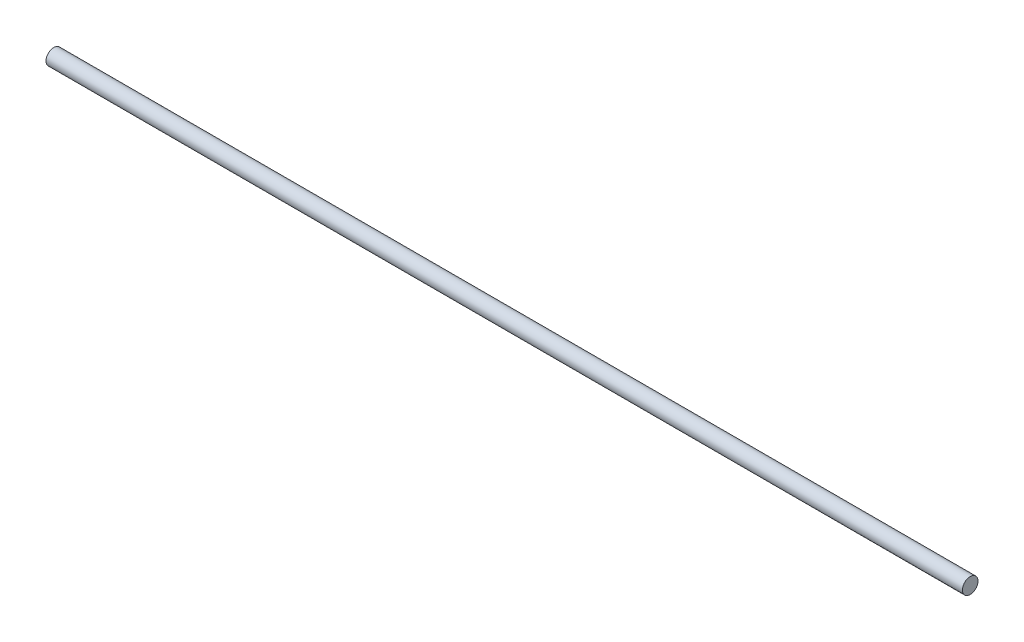
ISO-10303-21;
HEADER;
FILE_DESCRIPTION(('STEP AP214'),'2;1');
FILE_NAME('part.step','',(''),(''),'','','');
FILE_SCHEMA(('AUTOMOTIVE_DESIGN { 1 0 10303 214 1 1 1 1 }'));
ENDSEC;
DATA;
#1=APPLICATION_CONTEXT('core data for automotive mechanical design processes');
#2=APPLICATION_PROTOCOL_DEFINITION('international standard','automotive_design',2000,#1);
#3=PRODUCT_CONTEXT('',#1,'mechanical');
#4=PRODUCT('Part','Part','',(#3));
#5=PRODUCT_RELATED_PRODUCT_CATEGORY('part','',(#4));
#6=PRODUCT_DEFINITION_FORMATION('','',#4);
#7=PRODUCT_DEFINITION_CONTEXT('part definition',#1,'design');
#8=PRODUCT_DEFINITION('design','',#6,#7);
#9=PRODUCT_DEFINITION_SHAPE('','',#8);
#10=(LENGTH_UNIT() NAMED_UNIT(*) SI_UNIT(.MILLI.,.METRE.));
#11=(NAMED_UNIT(*) PLANE_ANGLE_UNIT() SI_UNIT($,.RADIAN.));
#12=(NAMED_UNIT(*) SI_UNIT($,.STERADIAN.) SOLID_ANGLE_UNIT());
#13=UNCERTAINTY_MEASURE_WITH_UNIT(LENGTH_MEASURE(1.E-05),#10,'distance_accuracy_value','');
#14=(GEOMETRIC_REPRESENTATION_CONTEXT(3) GLOBAL_UNCERTAINTY_ASSIGNED_CONTEXT((#13)) GLOBAL_UNIT_ASSIGNED_CONTEXT((#10,
#11,#12)) REPRESENTATION_CONTEXT('',''));
#15=CARTESIAN_POINT('',(0.,0.,0.));
#16=DIRECTION('',(0.,0.,1.));
#17=DIRECTION('',(1.,0.,0.));
#18=AXIS2_PLACEMENT_3D('',#15,#16,#17);
#19=CARTESIAN_POINT('',(470.,0.,0.));
#20=DIRECTION('',(-1.,0.,0.));
#21=DIRECTION('',(0.,0.,1.));
#22=AXIS2_PLACEMENT_3D('',#19,#20,#21);
#23=CYLINDRICAL_SURFACE('',#22,4.);
#24=CARTESIAN_POINT('',(470.,0.,0.));
#25=DIRECTION('',(1.,0.,0.));
#26=DIRECTION('',(0.,0.,-1.));
#27=AXIS2_PLACEMENT_3D('',#24,#25,#26);
#28=CIRCLE('',#27,4.);
#29=CARTESIAN_POINT('',(470.,0.,4.));
#30=VERTEX_POINT('',#29);
#31=EDGE_CURVE('E10',#30,#30,#28,.T.);
#32=CARTESIAN_POINT('',(0.,0.,0.));
#33=DIRECTION('',(1.,0.,0.));
#34=DIRECTION('',(0.,0.,-1.));
#35=AXIS2_PLACEMENT_3D('',#32,#33,#34);
#36=CIRCLE('',#35,4.);
#37=CARTESIAN_POINT('',(0.,0.,4.));
#38=VERTEX_POINT('',#37);
#39=EDGE_CURVE('E33',#38,#38,#36,.T.);
#40=CARTESIAN_POINT('',(470.,0.,4.));
#41=CARTESIAN_POINT('',(465.104166666667,0.,4.));
#42=CARTESIAN_POINT('',(460.208333333333,0.,4.));
#43=CARTESIAN_POINT('',(450.416666666667,0.,4.));
#44=CARTESIAN_POINT('',(445.520833333333,0.,4.));
#45=CARTESIAN_POINT('',(435.729166666667,0.,4.));
#46=CARTESIAN_POINT('',(430.833333333333,0.,4.));
#47=CARTESIAN_POINT('',(421.041666666667,0.,4.));
#48=CARTESIAN_POINT('',(416.145833333333,0.,4.));
#49=CARTESIAN_POINT('',(406.354166666667,0.,4.));
#50=CARTESIAN_POINT('',(401.458333333333,0.,4.));
#51=CARTESIAN_POINT('',(391.666666666667,0.,4.));
#52=CARTESIAN_POINT('',(386.770833333333,0.,4.));
#53=CARTESIAN_POINT('',(376.979166666667,0.,4.));
#54=CARTESIAN_POINT('',(372.083333333333,0.,4.));
#55=CARTESIAN_POINT('',(362.291666666667,0.,4.));
#56=CARTESIAN_POINT('',(357.395833333333,0.,4.));
#57=CARTESIAN_POINT('',(347.604166666667,0.,4.));
#58=CARTESIAN_POINT('',(342.708333333333,0.,4.));
#59=CARTESIAN_POINT('',(332.916666666667,0.,4.));
#60=CARTESIAN_POINT('',(328.020833333333,0.,4.));
#61=CARTESIAN_POINT('',(318.229166666667,0.,4.));
#62=CARTESIAN_POINT('',(313.333333333333,0.,4.));
#63=CARTESIAN_POINT('',(303.541666666667,0.,4.));
#64=CARTESIAN_POINT('',(298.645833333333,0.,4.));
#65=CARTESIAN_POINT('',(288.854166666667,0.,4.));
#66=CARTESIAN_POINT('',(283.958333333333,0.,4.));
#67=CARTESIAN_POINT('',(274.166666666667,0.,4.));
#68=CARTESIAN_POINT('',(269.270833333333,0.,4.));
#69=CARTESIAN_POINT('',(259.479166666667,0.,4.));
#70=CARTESIAN_POINT('',(254.583333333333,0.,4.));
#71=CARTESIAN_POINT('',(244.791666666667,0.,4.));
#72=CARTESIAN_POINT('',(239.895833333333,0.,4.));
#73=CARTESIAN_POINT('',(230.104166666667,0.,4.));
#74=CARTESIAN_POINT('',(225.208333333333,0.,4.));
#75=CARTESIAN_POINT('',(215.416666666667,0.,4.));
#76=CARTESIAN_POINT('',(210.520833333333,0.,4.));
#77=CARTESIAN_POINT('',(200.729166666667,0.,4.));
#78=CARTESIAN_POINT('',(195.833333333333,0.,4.));
#79=CARTESIAN_POINT('',(186.041666666667,0.,4.));
#80=CARTESIAN_POINT('',(181.145833333333,0.,4.));
#81=CARTESIAN_POINT('',(171.354166666667,0.,4.));
#82=CARTESIAN_POINT('',(166.458333333333,0.,4.));
#83=CARTESIAN_POINT('',(156.666666666667,0.,4.));
#84=CARTESIAN_POINT('',(151.770833333333,0.,4.));
#85=CARTESIAN_POINT('',(141.979166666667,0.,4.));
#86=CARTESIAN_POINT('',(137.083333333333,0.,4.));
#87=CARTESIAN_POINT('',(127.291666666667,0.,4.));
#88=CARTESIAN_POINT('',(122.395833333333,0.,4.));
#89=CARTESIAN_POINT('',(112.604166666667,0.,4.));
#90=CARTESIAN_POINT('',(107.708333333333,0.,4.));
#91=CARTESIAN_POINT('',(97.9166666666666,0.,4.));
#92=CARTESIAN_POINT('',(93.0208333333333,0.,4.));
#93=CARTESIAN_POINT('',(83.2291666666666,0.,4.));
#94=CARTESIAN_POINT('',(78.3333333333333,0.,4.));
#95=CARTESIAN_POINT('',(68.5416666666666,0.,4.));
#96=CARTESIAN_POINT('',(63.6458333333333,0.,4.));
#97=CARTESIAN_POINT('',(53.8541666666666,0.,4.));
#98=CARTESIAN_POINT('',(48.9583333333333,0.,4.));
#99=CARTESIAN_POINT('',(39.1666666666666,0.,4.));
#100=CARTESIAN_POINT('',(34.2708333333333,0.,4.));
#101=CARTESIAN_POINT('',(24.4791666666666,0.,4.));
#102=CARTESIAN_POINT('',(19.5833333333333,0.,4.));
#103=CARTESIAN_POINT('',(9.79166666666662,0.,4.));
#104=CARTESIAN_POINT('',(4.89583333333328,0.,4.));
#105=CARTESIAN_POINT('',(0.,0.,4.));
#106=B_SPLINE_CURVE_WITH_KNOTS('',3,(#40,#41,#42,#43,#44,#45,#46,#47,#48,#49,#50,#51,#52,#53,
#54,#55,#56,#57,#58,#59,#60,#61,#62,#63,#64,#65,#66,#67,#68,#69,#70,#71,#72,#73,#74,#75,#76,#77,
#78,#79,#80,#81,#82,#83,#84,#85,#86,#87,#88,#89,#90,#91,#92,#93,#94,#95,#96,#97,#98,#99,#100,
#101,#102,#103,#104,#105),.UNSPECIFIED.,.F.,.F.,(4,2,2,2,2,2,2,2,2,2,2,2,2,2,2,2,2,2,2,2,2,2,2,
2,2,2,2,2,2,2,2,2,4),(0.,14.6875,29.375,44.0625,58.75,73.4375,88.125,102.8125,117.5,132.1875,
146.875,161.5625,176.25,190.9375,205.625,220.3125,235.,249.6875,264.375,279.0625,293.75,
308.4375,323.125,337.8125,352.5,367.1875,381.875,396.5625,411.25,425.9375,440.625,455.3125,
470.),.UNSPECIFIED.);
#107=EDGE_CURVE('BSEAM30',#30,#38,#106,.T.);
#108=ORIENTED_EDGE('',*,*,#31,.F.);
#109=ORIENTED_EDGE('',*,*,#39,.T.);
#110=ORIENTED_EDGE('',*,*,#107,.T.);
#111=ORIENTED_EDGE('',*,*,#107,.F.);
#112=EDGE_LOOP('',(#108,#110,#109,#111));
#113=FACE_BOUND('',#112,.T.);
#114=ADVANCED_FACE('F30',(#113),#23,.T.);
#115=CARTESIAN_POINT('',(470.,0.,0.));
#116=DIRECTION('',(1.,0.,0.));
#117=DIRECTION('',(0.,0.,-1.));
#118=AXIS2_PLACEMENT_3D('',#115,#116,#117);
#119=PLANE('',#118);
#120=ORIENTED_EDGE('',*,*,#31,.T.);
#121=EDGE_LOOP('',(#120));
#122=FACE_BOUND('',#121,.T.);
#123=ADVANCED_FACE('F45',(#122),#119,.T.);
#124=CARTESIAN_POINT('',(0.,0.,0.));
#125=DIRECTION('',(1.,0.,0.));
#126=DIRECTION('',(0.,0.,-1.));
#127=AXIS2_PLACEMENT_3D('',#124,#125,#126);
#128=PLANE('',#127);
#129=ORIENTED_EDGE('',*,*,#39,.F.);
#130=EDGE_LOOP('',(#129));
#131=FACE_BOUND('',#130,.T.);
#132=ADVANCED_FACE('F43',(#131),#128,.F.);
#133=CLOSED_SHELL('',(#114,#123,#132));
#134=MANIFOLD_SOLID_BREP('B2',#133);
#135=ADVANCED_BREP_SHAPE_REPRESENTATION('',(#18,#134),#14);
#136=SHAPE_DEFINITION_REPRESENTATION(#9,#135);
ENDSEC;
END-ISO-10303-21;
